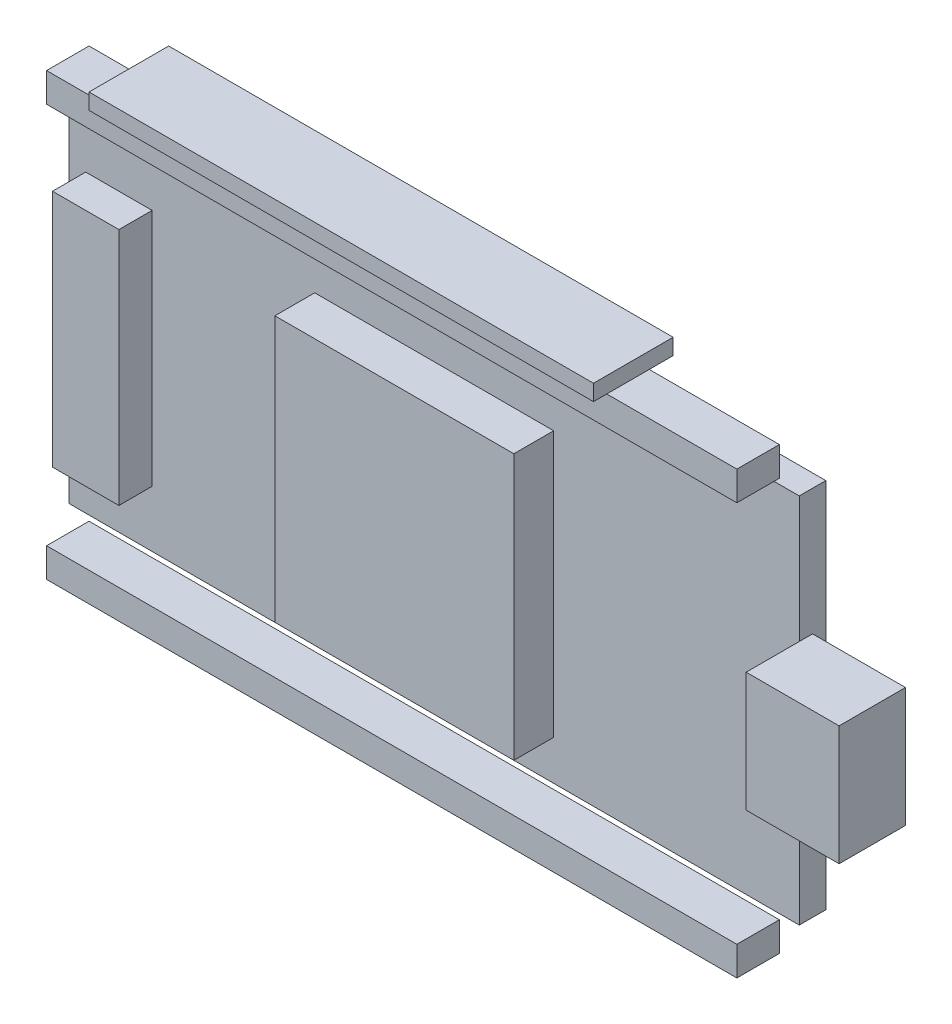
ISO-10303-21;
HEADER;
FILE_DESCRIPTION(('STEP AP214'),'2;1');
FILE_NAME('part.step','',(''),(''),'','','');
FILE_SCHEMA(('AUTOMOTIVE_DESIGN { 1 0 10303 214 1 1 1 1 }'));
ENDSEC;
DATA;
#1=APPLICATION_CONTEXT('core data for automotive mechanical design processes');
#2=APPLICATION_PROTOCOL_DEFINITION('international standard','automotive_design',2000,#1);
#3=PRODUCT_CONTEXT('',#1,'mechanical');
#4=PRODUCT('Part','Part','',(#3));
#5=PRODUCT_RELATED_PRODUCT_CATEGORY('part','',(#4));
#6=PRODUCT_DEFINITION_FORMATION('','',#4);
#7=PRODUCT_DEFINITION_CONTEXT('part definition',#1,'design');
#8=PRODUCT_DEFINITION('design','',#6,#7);
#9=PRODUCT_DEFINITION_SHAPE('','',#8);
#10=(LENGTH_UNIT() NAMED_UNIT(*) SI_UNIT(.MILLI.,.METRE.));
#11=(NAMED_UNIT(*) PLANE_ANGLE_UNIT() SI_UNIT($,.RADIAN.));
#12=(NAMED_UNIT(*) SI_UNIT($,.STERADIAN.) SOLID_ANGLE_UNIT());
#13=UNCERTAINTY_MEASURE_WITH_UNIT(LENGTH_MEASURE(1.E-05),#10,'distance_accuracy_value','');
#14=(GEOMETRIC_REPRESENTATION_CONTEXT(3) GLOBAL_UNCERTAINTY_ASSIGNED_CONTEXT((#13)) GLOBAL_UNIT_ASSIGNED_CONTEXT((#10,
#11,#12)) REPRESENTATION_CONTEXT('',''));
#15=CARTESIAN_POINT('',(0.,0.,0.));
#16=DIRECTION('',(0.,0.,1.));
#17=DIRECTION('',(1.,0.,0.));
#18=AXIS2_PLACEMENT_3D('',#15,#16,#17);
#19=CARTESIAN_POINT('',(19.,19.4,8.));
#20=DIRECTION('',(-1.,0.,0.));
#21=DIRECTION('',(0.,0.,1.));
#22=AXIS2_PLACEMENT_3D('',#19,#20,#21);
#23=PLANE('',#22);
#24=DIRECTION('',(0.,1.,0.));
#25=VECTOR('',#24,1.);
#26=CARTESIAN_POINT('',(19.,19.4,2.));
#27=LINE('',#26,#25);
#28=CARTESIAN_POINT('',(19.,19.4,2.));
#29=VERTEX_POINT('',#28);
#30=CARTESIAN_POINT('',(19.,20.6,2.));
#31=VERTEX_POINT('',#30);
#32=EDGE_CURVE('E109',#29,#31,#27,.T.);
#33=ORIENTED_EDGE('',*,*,#32,.T.);
#34=DIRECTION('',(0.,0.,-1.));
#35=VECTOR('',#34,1.);
#36=CARTESIAN_POINT('',(19.,20.6,8.));
#37=LINE('',#36,#35);
#38=CARTESIAN_POINT('',(19.,20.6,8.));
#39=VERTEX_POINT('',#38);
#40=EDGE_CURVE('E12',#39,#31,#37,.T.);
#41=ORIENTED_EDGE('',*,*,#40,.F.);
#42=DIRECTION('',(0.,1.,0.));
#43=VECTOR('',#42,1.);
#44=CARTESIAN_POINT('',(19.,19.4,8.));
#45=LINE('',#44,#43);
#46=CARTESIAN_POINT('',(19.,19.4,8.));
#47=VERTEX_POINT('',#46);
#48=EDGE_CURVE('E97',#47,#39,#45,.T.);
#49=ORIENTED_EDGE('',*,*,#48,.F.);
#50=DIRECTION('',(0.,0.,-1.));
#51=VECTOR('',#50,1.);
#52=CARTESIAN_POINT('',(19.,19.4,8.));
#53=LINE('',#52,#51);
#54=EDGE_CURVE('E105',#47,#29,#53,.T.);
#55=ORIENTED_EDGE('',*,*,#54,.T.);
#56=EDGE_LOOP('',(#33,#41,#49,#55));
#57=FACE_BOUND('',#56,.T.);
#58=ADVANCED_FACE('F46',(#57),#23,.F.);
#59=CARTESIAN_POINT('',(-19.,20.6,8.));
#60=DIRECTION('',(0.,-1.,0.));
#61=DIRECTION('',(0.,0.,-1.));
#62=AXIS2_PLACEMENT_3D('',#59,#60,#61);
#63=PLANE('',#62);
#64=DIRECTION('',(-1.,0.,0.));
#65=VECTOR('',#64,1.);
#66=CARTESIAN_POINT('',(-19.,20.6,2.));
#67=LINE('',#66,#65);
#68=CARTESIAN_POINT('',(-19.,20.6,2.));
#69=VERTEX_POINT('',#68);
#70=EDGE_CURVE('E101',#31,#69,#67,.T.);
#71=ORIENTED_EDGE('',*,*,#70,.T.);
#72=DIRECTION('',(0.,0.,-1.));
#73=VECTOR('',#72,1.);
#74=CARTESIAN_POINT('',(-19.,20.6,8.));
#75=LINE('',#74,#73);
#76=CARTESIAN_POINT('',(-19.,20.6,8.));
#77=VERTEX_POINT('',#76);
#78=EDGE_CURVE('E54',#77,#69,#75,.T.);
#79=ORIENTED_EDGE('',*,*,#78,.F.);
#80=DIRECTION('',(-1.,0.,0.));
#81=VECTOR('',#80,1.);
#82=CARTESIAN_POINT('',(-19.,20.6,8.));
#83=LINE('',#82,#81);
#84=EDGE_CURVE('E92',#39,#77,#83,.T.);
#85=ORIENTED_EDGE('',*,*,#84,.F.);
#86=ORIENTED_EDGE('',*,*,#40,.T.);
#87=EDGE_LOOP('',(#71,#79,#85,#86));
#88=FACE_BOUND('',#87,.T.);
#89=ADVANCED_FACE('F100',(#88),#63,.F.);
#90=CARTESIAN_POINT('',(-19.,19.4,8.));
#91=DIRECTION('',(1.,0.,0.));
#92=DIRECTION('',(0.,0.,-1.));
#93=AXIS2_PLACEMENT_3D('',#90,#91,#92);
#94=PLANE('',#93);
#95=DIRECTION('',(0.,-1.,0.));
#96=VECTOR('',#95,1.);
#97=CARTESIAN_POINT('',(-19.,19.4,2.));
#98=LINE('',#97,#96);
#99=CARTESIAN_POINT('',(-19.,19.4,2.));
#100=VERTEX_POINT('',#99);
#101=EDGE_CURVE('E79',#69,#100,#98,.T.);
#102=ORIENTED_EDGE('',*,*,#101,.T.);
#103=DIRECTION('',(0.,0.,-1.));
#104=VECTOR('',#103,1.);
#105=CARTESIAN_POINT('',(-19.,19.4,8.));
#106=LINE('',#105,#104);
#107=CARTESIAN_POINT('',(-19.,19.4,8.));
#108=VERTEX_POINT('',#107);
#109=EDGE_CURVE('E102',#108,#100,#106,.T.);
#110=ORIENTED_EDGE('',*,*,#109,.F.);
#111=DIRECTION('',(0.,-1.,0.));
#112=VECTOR('',#111,1.);
#113=CARTESIAN_POINT('',(-19.,19.4,8.));
#114=LINE('',#113,#112);
#115=EDGE_CURVE('E95',#77,#108,#114,.T.);
#116=ORIENTED_EDGE('',*,*,#115,.F.);
#117=ORIENTED_EDGE('',*,*,#78,.T.);
#118=EDGE_LOOP('',(#102,#110,#116,#117));
#119=FACE_BOUND('',#118,.T.);
#120=ADVANCED_FACE('F103',(#119),#94,.F.);
#121=CARTESIAN_POINT('',(-19.,19.4,8.));
#122=DIRECTION('',(0.,1.,0.));
#123=DIRECTION('',(0.,0.,1.));
#124=AXIS2_PLACEMENT_3D('',#121,#122,#123);
#125=PLANE('',#124);
#126=DIRECTION('',(1.,0.,0.));
#127=VECTOR('',#126,1.);
#128=CARTESIAN_POINT('',(-19.,19.4,2.));
#129=LINE('',#128,#127);
#130=EDGE_CURVE('E85',#100,#29,#129,.T.);
#131=ORIENTED_EDGE('',*,*,#130,.T.);
#132=ORIENTED_EDGE('',*,*,#54,.F.);
#133=DIRECTION('',(1.,0.,0.));
#134=VECTOR('',#133,1.);
#135=CARTESIAN_POINT('',(-19.,19.4,8.));
#136=LINE('',#135,#134);
#137=EDGE_CURVE('E62',#108,#47,#136,.T.);
#138=ORIENTED_EDGE('',*,*,#137,.F.);
#139=ORIENTED_EDGE('',*,*,#109,.T.);
#140=EDGE_LOOP('',(#131,#132,#138,#139));
#141=FACE_BOUND('',#140,.T.);
#142=ADVANCED_FACE('F116',(#141),#125,.F.);
#143=CARTESIAN_POINT('',(0.,0.,8.));
#144=DIRECTION('',(0.,0.,-1.));
#145=DIRECTION('',(-1.,0.,0.));
#146=AXIS2_PLACEMENT_3D('',#143,#144,#145);
#147=PLANE('',#146);
#148=ORIENTED_EDGE('',*,*,#48,.T.);
#149=ORIENTED_EDGE('',*,*,#84,.T.);
#150=ORIENTED_EDGE('',*,*,#115,.T.);
#151=ORIENTED_EDGE('',*,*,#137,.T.);
#152=EDGE_LOOP('',(#148,#149,#150,#151));
#153=FACE_BOUND('',#152,.T.);
#154=ADVANCED_FACE('F93',(#153),#147,.F.);
#155=CARTESIAN_POINT('',(0.,0.,2.));
#156=DIRECTION('',(0.,0.,-1.));
#157=DIRECTION('',(-1.,0.,0.));
#158=AXIS2_PLACEMENT_3D('',#155,#156,#157);
#159=PLANE('',#158);
#160=ORIENTED_EDGE('',*,*,#32,.F.);
#161=ORIENTED_EDGE('',*,*,#130,.F.);
#162=ORIENTED_EDGE('',*,*,#101,.F.);
#163=ORIENTED_EDGE('',*,*,#70,.F.);
#164=EDGE_LOOP('',(#160,#161,#162,#163));
#165=FACE_BOUND('',#164,.T.);
#166=ADVANCED_FACE('F119',(#165),#159,.T.);
#167=CLOSED_SHELL('',(#58,#89,#120,#142,#154,#166));
#168=MANIFOLD_SOLID_BREP('B2',#167);
#169=CARTESIAN_POINT('',(26.,14.4,4.2));
#170=DIRECTION('',(-1.,0.,0.));
#171=DIRECTION('',(0.,0.,1.));
#172=AXIS2_PLACEMENT_3D('',#169,#170,#171);
#173=PLANE('',#172);
#174=DIRECTION('',(0.,1.,0.));
#175=VECTOR('',#174,1.);
#176=CARTESIAN_POINT('',(26.,14.4,1.));
#177=LINE('',#176,#175);
#178=CARTESIAN_POINT('',(26.,14.4,1.));
#179=VERTEX_POINT('',#178);
#180=CARTESIAN_POINT('',(26.,16.6,1.));
#181=VERTEX_POINT('',#180);
#182=EDGE_CURVE('E243',#179,#181,#177,.T.);
#183=ORIENTED_EDGE('',*,*,#182,.T.);
#184=DIRECTION('',(0.,0.,-1.));
#185=VECTOR('',#184,1.);
#186=CARTESIAN_POINT('',(26.,16.6,4.2));
#187=LINE('',#186,#185);
#188=CARTESIAN_POINT('',(26.,16.6,4.2));
#189=VERTEX_POINT('',#188);
#190=EDGE_CURVE('E44',#189,#181,#187,.T.);
#191=ORIENTED_EDGE('',*,*,#190,.F.);
#192=DIRECTION('',(0.,1.,0.));
#193=VECTOR('',#192,1.);
#194=CARTESIAN_POINT('',(26.,14.4,4.2));
#195=LINE('',#194,#193);
#196=CARTESIAN_POINT('',(26.,14.4,4.2));
#197=VERTEX_POINT('',#196);
#198=EDGE_CURVE('E231',#197,#189,#195,.T.);
#199=ORIENTED_EDGE('',*,*,#198,.F.);
#200=DIRECTION('',(0.,0.,-1.));
#201=VECTOR('',#200,1.);
#202=CARTESIAN_POINT('',(26.,14.4,4.2));
#203=LINE('',#202,#201);
#204=EDGE_CURVE('E239',#197,#179,#203,.T.);
#205=ORIENTED_EDGE('',*,*,#204,.T.);
#206=EDGE_LOOP('',(#183,#191,#199,#205));
#207=FACE_BOUND('',#206,.T.);
#208=ADVANCED_FACE('F180',(#207),#173,.F.);
#209=CARTESIAN_POINT('',(-26.,16.6,4.2));
#210=DIRECTION('',(0.,-1.,0.));
#211=DIRECTION('',(0.,0.,-1.));
#212=AXIS2_PLACEMENT_3D('',#209,#210,#211);
#213=PLANE('',#212);
#214=DIRECTION('',(-1.,0.,0.));
#215=VECTOR('',#214,1.);
#216=CARTESIAN_POINT('',(-26.,16.6,1.));
#217=LINE('',#216,#215);
#218=CARTESIAN_POINT('',(-26.,16.6,1.));
#219=VERTEX_POINT('',#218);
#220=EDGE_CURVE('E235',#181,#219,#217,.T.);
#221=ORIENTED_EDGE('',*,*,#220,.T.);
#222=DIRECTION('',(0.,0.,-1.));
#223=VECTOR('',#222,1.);
#224=CARTESIAN_POINT('',(-26.,16.6,4.2));
#225=LINE('',#224,#223);
#226=CARTESIAN_POINT('',(-26.,16.6,4.2));
#227=VERTEX_POINT('',#226);
#228=EDGE_CURVE('E188',#227,#219,#225,.T.);
#229=ORIENTED_EDGE('',*,*,#228,.F.);
#230=DIRECTION('',(-1.,0.,0.));
#231=VECTOR('',#230,1.);
#232=CARTESIAN_POINT('',(-26.,16.6,4.2));
#233=LINE('',#232,#231);
#234=EDGE_CURVE('E226',#189,#227,#233,.T.);
#235=ORIENTED_EDGE('',*,*,#234,.F.);
#236=ORIENTED_EDGE('',*,*,#190,.T.);
#237=EDGE_LOOP('',(#221,#229,#235,#236));
#238=FACE_BOUND('',#237,.T.);
#239=ADVANCED_FACE('F234',(#238),#213,.F.);
#240=CARTESIAN_POINT('',(-26.,14.4,4.2));
#241=DIRECTION('',(1.,0.,0.));
#242=DIRECTION('',(0.,0.,-1.));
#243=AXIS2_PLACEMENT_3D('',#240,#241,#242);
#244=PLANE('',#243);
#245=DIRECTION('',(0.,-1.,0.));
#246=VECTOR('',#245,1.);
#247=CARTESIAN_POINT('',(-26.,14.4,1.));
#248=LINE('',#247,#246);
#249=CARTESIAN_POINT('',(-26.,14.4,1.));
#250=VERTEX_POINT('',#249);
#251=EDGE_CURVE('E213',#219,#250,#248,.T.);
#252=ORIENTED_EDGE('',*,*,#251,.T.);
#253=DIRECTION('',(0.,0.,-1.));
#254=VECTOR('',#253,1.);
#255=CARTESIAN_POINT('',(-26.,14.4,4.2));
#256=LINE('',#255,#254);
#257=CARTESIAN_POINT('',(-26.,14.4,4.2));
#258=VERTEX_POINT('',#257);
#259=EDGE_CURVE('E236',#258,#250,#256,.T.);
#260=ORIENTED_EDGE('',*,*,#259,.F.);
#261=DIRECTION('',(0.,-1.,0.));
#262=VECTOR('',#261,1.);
#263=CARTESIAN_POINT('',(-26.,14.4,4.2));
#264=LINE('',#263,#262);
#265=EDGE_CURVE('E229',#227,#258,#264,.T.);
#266=ORIENTED_EDGE('',*,*,#265,.F.);
#267=ORIENTED_EDGE('',*,*,#228,.T.);
#268=EDGE_LOOP('',(#252,#260,#266,#267));
#269=FACE_BOUND('',#268,.T.);
#270=ADVANCED_FACE('F237',(#269),#244,.F.);
#271=CARTESIAN_POINT('',(-26.,14.4,4.2));
#272=DIRECTION('',(0.,1.,0.));
#273=DIRECTION('',(0.,0.,1.));
#274=AXIS2_PLACEMENT_3D('',#271,#272,#273);
#275=PLANE('',#274);
#276=DIRECTION('',(1.,0.,0.));
#277=VECTOR('',#276,1.);
#278=CARTESIAN_POINT('',(-26.,14.4,1.));
#279=LINE('',#278,#277);
#280=EDGE_CURVE('E219',#250,#179,#279,.T.);
#281=ORIENTED_EDGE('',*,*,#280,.T.);
#282=ORIENTED_EDGE('',*,*,#204,.F.);
#283=DIRECTION('',(1.,0.,0.));
#284=VECTOR('',#283,1.);
#285=CARTESIAN_POINT('',(-26.,14.4,4.2));
#286=LINE('',#285,#284);
#287=EDGE_CURVE('E196',#258,#197,#286,.T.);
#288=ORIENTED_EDGE('',*,*,#287,.F.);
#289=ORIENTED_EDGE('',*,*,#259,.T.);
#290=EDGE_LOOP('',(#281,#282,#288,#289));
#291=FACE_BOUND('',#290,.T.);
#292=ADVANCED_FACE('F250',(#291),#275,.F.);
#293=CARTESIAN_POINT('',(0.,0.,4.2));
#294=DIRECTION('',(0.,0.,-1.));
#295=DIRECTION('',(-1.,0.,0.));
#296=AXIS2_PLACEMENT_3D('',#293,#294,#295);
#297=PLANE('',#296);
#298=ORIENTED_EDGE('',*,*,#198,.T.);
#299=ORIENTED_EDGE('',*,*,#234,.T.);
#300=ORIENTED_EDGE('',*,*,#265,.T.);
#301=ORIENTED_EDGE('',*,*,#287,.T.);
#302=EDGE_LOOP('',(#298,#299,#300,#301));
#303=FACE_BOUND('',#302,.T.);
#304=ADVANCED_FACE('F227',(#303),#297,.F.);
#305=CARTESIAN_POINT('',(0.,0.,1.));
#306=DIRECTION('',(0.,0.,-1.));
#307=DIRECTION('',(-1.,0.,0.));
#308=AXIS2_PLACEMENT_3D('',#305,#306,#307);
#309=PLANE('',#308);
#310=ORIENTED_EDGE('',*,*,#182,.F.);
#311=ORIENTED_EDGE('',*,*,#280,.F.);
#312=ORIENTED_EDGE('',*,*,#251,.F.);
#313=ORIENTED_EDGE('',*,*,#220,.F.);
#314=EDGE_LOOP('',(#310,#311,#312,#313));
#315=FACE_BOUND('',#314,.T.);
#316=ADVANCED_FACE('F253',(#315),#309,.T.);
#317=CLOSED_SHELL('',(#208,#239,#270,#292,#304,#316));
#318=MANIFOLD_SOLID_BREP('B6',#317);
#319=CARTESIAN_POINT('',(26.,-16.6,4.2));
#320=DIRECTION('',(-1.,0.,0.));
#321=DIRECTION('',(0.,0.,1.));
#322=AXIS2_PLACEMENT_3D('',#319,#320,#321);
#323=PLANE('',#322);
#324=DIRECTION('',(0.,1.,0.));
#325=VECTOR('',#324,1.);
#326=CARTESIAN_POINT('',(26.,-16.6,1.));
#327=LINE('',#326,#325);
#328=CARTESIAN_POINT('',(26.,-16.6,1.));
#329=VERTEX_POINT('',#328);
#330=CARTESIAN_POINT('',(26.,-14.4,1.));
#331=VERTEX_POINT('',#330);
#332=EDGE_CURVE('E377',#329,#331,#327,.T.);
#333=ORIENTED_EDGE('',*,*,#332,.T.);
#334=DIRECTION('',(0.,0.,-1.));
#335=VECTOR('',#334,1.);
#336=CARTESIAN_POINT('',(26.,-14.4,4.2));
#337=LINE('',#336,#335);
#338=CARTESIAN_POINT('',(26.,-14.4,4.2));
#339=VERTEX_POINT('',#338);
#340=EDGE_CURVE('E178',#339,#331,#337,.T.);
#341=ORIENTED_EDGE('',*,*,#340,.F.);
#342=DIRECTION('',(0.,1.,0.));
#343=VECTOR('',#342,1.);
#344=CARTESIAN_POINT('',(26.,-16.6,4.2));
#345=LINE('',#344,#343);
#346=CARTESIAN_POINT('',(26.,-16.6,4.2));
#347=VERTEX_POINT('',#346);
#348=EDGE_CURVE('E365',#347,#339,#345,.T.);
#349=ORIENTED_EDGE('',*,*,#348,.F.);
#350=DIRECTION('',(0.,0.,-1.));
#351=VECTOR('',#350,1.);
#352=CARTESIAN_POINT('',(26.,-16.6,4.2));
#353=LINE('',#352,#351);
#354=EDGE_CURVE('E373',#347,#329,#353,.T.);
#355=ORIENTED_EDGE('',*,*,#354,.T.);
#356=EDGE_LOOP('',(#333,#341,#349,#355));
#357=FACE_BOUND('',#356,.T.);
#358=ADVANCED_FACE('F314',(#357),#323,.F.);
#359=CARTESIAN_POINT('',(-26.,-14.4,4.2));
#360=DIRECTION('',(0.,-1.,0.));
#361=DIRECTION('',(0.,0.,-1.));
#362=AXIS2_PLACEMENT_3D('',#359,#360,#361);
#363=PLANE('',#362);
#364=DIRECTION('',(-1.,0.,0.));
#365=VECTOR('',#364,1.);
#366=CARTESIAN_POINT('',(-26.,-14.4,1.));
#367=LINE('',#366,#365);
#368=CARTESIAN_POINT('',(-26.,-14.4,1.));
#369=VERTEX_POINT('',#368);
#370=EDGE_CURVE('E369',#331,#369,#367,.T.);
#371=ORIENTED_EDGE('',*,*,#370,.T.);
#372=DIRECTION('',(0.,0.,-1.));
#373=VECTOR('',#372,1.);
#374=CARTESIAN_POINT('',(-26.,-14.4,4.2));
#375=LINE('',#374,#373);
#376=CARTESIAN_POINT('',(-26.,-14.4,4.2));
#377=VERTEX_POINT('',#376);
#378=EDGE_CURVE('E322',#377,#369,#375,.T.);
#379=ORIENTED_EDGE('',*,*,#378,.F.);
#380=DIRECTION('',(-1.,0.,0.));
#381=VECTOR('',#380,1.);
#382=CARTESIAN_POINT('',(-26.,-14.4,4.2));
#383=LINE('',#382,#381);
#384=EDGE_CURVE('E360',#339,#377,#383,.T.);
#385=ORIENTED_EDGE('',*,*,#384,.F.);
#386=ORIENTED_EDGE('',*,*,#340,.T.);
#387=EDGE_LOOP('',(#371,#379,#385,#386));
#388=FACE_BOUND('',#387,.T.);
#389=ADVANCED_FACE('F368',(#388),#363,.F.);
#390=CARTESIAN_POINT('',(-26.,-16.6,4.2));
#391=DIRECTION('',(1.,0.,0.));
#392=DIRECTION('',(0.,0.,-1.));
#393=AXIS2_PLACEMENT_3D('',#390,#391,#392);
#394=PLANE('',#393);
#395=DIRECTION('',(0.,-1.,0.));
#396=VECTOR('',#395,1.);
#397=CARTESIAN_POINT('',(-26.,-16.6,1.));
#398=LINE('',#397,#396);
#399=CARTESIAN_POINT('',(-26.,-16.6,1.));
#400=VERTEX_POINT('',#399);
#401=EDGE_CURVE('E347',#369,#400,#398,.T.);
#402=ORIENTED_EDGE('',*,*,#401,.T.);
#403=DIRECTION('',(0.,0.,-1.));
#404=VECTOR('',#403,1.);
#405=CARTESIAN_POINT('',(-26.,-16.6,4.2));
#406=LINE('',#405,#404);
#407=CARTESIAN_POINT('',(-26.,-16.6,4.2));
#408=VERTEX_POINT('',#407);
#409=EDGE_CURVE('E370',#408,#400,#406,.T.);
#410=ORIENTED_EDGE('',*,*,#409,.F.);
#411=DIRECTION('',(0.,-1.,0.));
#412=VECTOR('',#411,1.);
#413=CARTESIAN_POINT('',(-26.,-16.6,4.2));
#414=LINE('',#413,#412);
#415=EDGE_CURVE('E363',#377,#408,#414,.T.);
#416=ORIENTED_EDGE('',*,*,#415,.F.);
#417=ORIENTED_EDGE('',*,*,#378,.T.);
#418=EDGE_LOOP('',(#402,#410,#416,#417));
#419=FACE_BOUND('',#418,.T.);
#420=ADVANCED_FACE('F371',(#419),#394,.F.);
#421=CARTESIAN_POINT('',(-26.,-16.6,4.2));
#422=DIRECTION('',(0.,1.,0.));
#423=DIRECTION('',(0.,0.,1.));
#424=AXIS2_PLACEMENT_3D('',#421,#422,#423);
#425=PLANE('',#424);
#426=DIRECTION('',(1.,0.,0.));
#427=VECTOR('',#426,1.);
#428=CARTESIAN_POINT('',(-26.,-16.6,1.));
#429=LINE('',#428,#427);
#430=EDGE_CURVE('E353',#400,#329,#429,.T.);
#431=ORIENTED_EDGE('',*,*,#430,.T.);
#432=ORIENTED_EDGE('',*,*,#354,.F.);
#433=DIRECTION('',(1.,0.,0.));
#434=VECTOR('',#433,1.);
#435=CARTESIAN_POINT('',(-26.,-16.6,4.2));
#436=LINE('',#435,#434);
#437=EDGE_CURVE('E330',#408,#347,#436,.T.);
#438=ORIENTED_EDGE('',*,*,#437,.F.);
#439=ORIENTED_EDGE('',*,*,#409,.T.);
#440=EDGE_LOOP('',(#431,#432,#438,#439));
#441=FACE_BOUND('',#440,.T.);
#442=ADVANCED_FACE('F384',(#441),#425,.F.);
#443=CARTESIAN_POINT('',(0.,0.,4.2));
#444=DIRECTION('',(0.,0.,-1.));
#445=DIRECTION('',(-1.,0.,0.));
#446=AXIS2_PLACEMENT_3D('',#443,#444,#445);
#447=PLANE('',#446);
#448=ORIENTED_EDGE('',*,*,#348,.T.);
#449=ORIENTED_EDGE('',*,*,#384,.T.);
#450=ORIENTED_EDGE('',*,*,#415,.T.);
#451=ORIENTED_EDGE('',*,*,#437,.T.);
#452=EDGE_LOOP('',(#448,#449,#450,#451));
#453=FACE_BOUND('',#452,.T.);
#454=ADVANCED_FACE('F361',(#453),#447,.F.);
#455=CARTESIAN_POINT('',(0.,0.,1.));
#456=DIRECTION('',(0.,0.,-1.));
#457=DIRECTION('',(-1.,0.,0.));
#458=AXIS2_PLACEMENT_3D('',#455,#456,#457);
#459=PLANE('',#458);
#460=ORIENTED_EDGE('',*,*,#332,.F.);
#461=ORIENTED_EDGE('',*,*,#430,.F.);
#462=ORIENTED_EDGE('',*,*,#401,.F.);
#463=ORIENTED_EDGE('',*,*,#370,.F.);
#464=EDGE_LOOP('',(#460,#461,#462,#463));
#465=FACE_BOUND('',#464,.T.);
#466=ADVANCED_FACE('F387',(#465),#459,.T.);
#467=CLOSED_SHELL('',(#358,#389,#420,#442,#454,#466));
#468=MANIFOLD_SOLID_BREP('B38',#467);
#469=CARTESIAN_POINT('',(-20.5,-9.,4.25));
#470=DIRECTION('',(-1.,0.,0.));
#471=DIRECTION('',(0.,0.,1.));
#472=AXIS2_PLACEMENT_3D('',#469,#470,#471);
#473=PLANE('',#472);
#474=DIRECTION('',(0.,1.,0.));
#475=VECTOR('',#474,1.);
#476=CARTESIAN_POINT('',(-20.5,-9.,1.75));
#477=LINE('',#476,#475);
#478=CARTESIAN_POINT('',(-20.5,-9.,1.75));
#479=VERTEX_POINT('',#478);
#480=CARTESIAN_POINT('',(-20.5,9.,1.75));
#481=VERTEX_POINT('',#480);
#482=EDGE_CURVE('E511',#479,#481,#477,.T.);
#483=ORIENTED_EDGE('',*,*,#482,.T.);
#484=DIRECTION('',(0.,0.,-1.));
#485=VECTOR('',#484,1.);
#486=CARTESIAN_POINT('',(-20.5,9.,4.25));
#487=LINE('',#486,#485);
#488=CARTESIAN_POINT('',(-20.5,9.,4.25));
#489=VERTEX_POINT('',#488);
#490=EDGE_CURVE('E312',#489,#481,#487,.T.);
#491=ORIENTED_EDGE('',*,*,#490,.F.);
#492=DIRECTION('',(0.,1.,0.));
#493=VECTOR('',#492,1.);
#494=CARTESIAN_POINT('',(-20.5,-9.,4.25));
#495=LINE('',#494,#493);
#496=CARTESIAN_POINT('',(-20.5,-9.,4.25));
#497=VERTEX_POINT('',#496);
#498=EDGE_CURVE('E499',#497,#489,#495,.T.);
#499=ORIENTED_EDGE('',*,*,#498,.F.);
#500=DIRECTION('',(0.,0.,-1.));
#501=VECTOR('',#500,1.);
#502=CARTESIAN_POINT('',(-20.5,-9.,4.25));
#503=LINE('',#502,#501);
#504=EDGE_CURVE('E507',#497,#479,#503,.T.);
#505=ORIENTED_EDGE('',*,*,#504,.T.);
#506=EDGE_LOOP('',(#483,#491,#499,#505));
#507=FACE_BOUND('',#506,.T.);
#508=ADVANCED_FACE('F448',(#507),#473,.F.);
#509=CARTESIAN_POINT('',(-25.5,9.,4.25));
#510=DIRECTION('',(0.,-1.,0.));
#511=DIRECTION('',(0.,0.,-1.));
#512=AXIS2_PLACEMENT_3D('',#509,#510,#511);
#513=PLANE('',#512);
#514=DIRECTION('',(-1.,0.,0.));
#515=VECTOR('',#514,1.);
#516=CARTESIAN_POINT('',(-25.5,9.,1.75));
#517=LINE('',#516,#515);
#518=CARTESIAN_POINT('',(-25.5,9.,1.75));
#519=VERTEX_POINT('',#518);
#520=EDGE_CURVE('E503',#481,#519,#517,.T.);
#521=ORIENTED_EDGE('',*,*,#520,.T.);
#522=DIRECTION('',(0.,0.,-1.));
#523=VECTOR('',#522,1.);
#524=CARTESIAN_POINT('',(-25.5,9.,4.25));
#525=LINE('',#524,#523);
#526=CARTESIAN_POINT('',(-25.5,9.,4.25));
#527=VERTEX_POINT('',#526);
#528=EDGE_CURVE('E456',#527,#519,#525,.T.);
#529=ORIENTED_EDGE('',*,*,#528,.F.);
#530=DIRECTION('',(-1.,0.,0.));
#531=VECTOR('',#530,1.);
#532=CARTESIAN_POINT('',(-25.5,9.,4.25));
#533=LINE('',#532,#531);
#534=EDGE_CURVE('E494',#489,#527,#533,.T.);
#535=ORIENTED_EDGE('',*,*,#534,.F.);
#536=ORIENTED_EDGE('',*,*,#490,.T.);
#537=EDGE_LOOP('',(#521,#529,#535,#536));
#538=FACE_BOUND('',#537,.T.);
#539=ADVANCED_FACE('F502',(#538),#513,.F.);
#540=CARTESIAN_POINT('',(-25.5,-9.,4.25));
#541=DIRECTION('',(1.,0.,0.));
#542=DIRECTION('',(0.,0.,-1.));
#543=AXIS2_PLACEMENT_3D('',#540,#541,#542);
#544=PLANE('',#543);
#545=DIRECTION('',(0.,-1.,0.));
#546=VECTOR('',#545,1.);
#547=CARTESIAN_POINT('',(-25.5,-9.,1.75));
#548=LINE('',#547,#546);
#549=CARTESIAN_POINT('',(-25.5,-9.,1.75));
#550=VERTEX_POINT('',#549);
#551=EDGE_CURVE('E481',#519,#550,#548,.T.);
#552=ORIENTED_EDGE('',*,*,#551,.T.);
#553=DIRECTION('',(0.,0.,-1.));
#554=VECTOR('',#553,1.);
#555=CARTESIAN_POINT('',(-25.5,-9.,4.25));
#556=LINE('',#555,#554);
#557=CARTESIAN_POINT('',(-25.5,-9.,4.25));
#558=VERTEX_POINT('',#557);
#559=EDGE_CURVE('E504',#558,#550,#556,.T.);
#560=ORIENTED_EDGE('',*,*,#559,.F.);
#561=DIRECTION('',(0.,-1.,0.));
#562=VECTOR('',#561,1.);
#563=CARTESIAN_POINT('',(-25.5,-9.,4.25));
#564=LINE('',#563,#562);
#565=EDGE_CURVE('E497',#527,#558,#564,.T.);
#566=ORIENTED_EDGE('',*,*,#565,.F.);
#567=ORIENTED_EDGE('',*,*,#528,.T.);
#568=EDGE_LOOP('',(#552,#560,#566,#567));
#569=FACE_BOUND('',#568,.T.);
#570=ADVANCED_FACE('F505',(#569),#544,.F.);
#571=CARTESIAN_POINT('',(-25.5,-9.,4.25));
#572=DIRECTION('',(0.,1.,0.));
#573=DIRECTION('',(0.,0.,1.));
#574=AXIS2_PLACEMENT_3D('',#571,#572,#573);
#575=PLANE('',#574);
#576=DIRECTION('',(1.,0.,0.));
#577=VECTOR('',#576,1.);
#578=CARTESIAN_POINT('',(-25.5,-9.,1.75));
#579=LINE('',#578,#577);
#580=EDGE_CURVE('E487',#550,#479,#579,.T.);
#581=ORIENTED_EDGE('',*,*,#580,.T.);
#582=ORIENTED_EDGE('',*,*,#504,.F.);
#583=DIRECTION('',(1.,0.,0.));
#584=VECTOR('',#583,1.);
#585=CARTESIAN_POINT('',(-25.5,-9.,4.25));
#586=LINE('',#585,#584);
#587=EDGE_CURVE('E464',#558,#497,#586,.T.);
#588=ORIENTED_EDGE('',*,*,#587,.F.);
#589=ORIENTED_EDGE('',*,*,#559,.T.);
#590=EDGE_LOOP('',(#581,#582,#588,#589));
#591=FACE_BOUND('',#590,.T.);
#592=ADVANCED_FACE('F518',(#591),#575,.F.);
#593=CARTESIAN_POINT('',(0.,0.,4.25));
#594=DIRECTION('',(0.,0.,-1.));
#595=DIRECTION('',(-1.,0.,0.));
#596=AXIS2_PLACEMENT_3D('',#593,#594,#595);
#597=PLANE('',#596);
#598=ORIENTED_EDGE('',*,*,#498,.T.);
#599=ORIENTED_EDGE('',*,*,#534,.T.);
#600=ORIENTED_EDGE('',*,*,#565,.T.);
#601=ORIENTED_EDGE('',*,*,#587,.T.);
#602=EDGE_LOOP('',(#598,#599,#600,#601));
#603=FACE_BOUND('',#602,.T.);
#604=ADVANCED_FACE('F495',(#603),#597,.F.);
#605=CARTESIAN_POINT('',(0.,0.,1.75));
#606=DIRECTION('',(0.,0.,-1.));
#607=DIRECTION('',(-1.,0.,0.));
#608=AXIS2_PLACEMENT_3D('',#605,#606,#607);
#609=PLANE('',#608);
#610=ORIENTED_EDGE('',*,*,#482,.F.);
#611=ORIENTED_EDGE('',*,*,#580,.F.);
#612=ORIENTED_EDGE('',*,*,#551,.F.);
#613=ORIENTED_EDGE('',*,*,#520,.F.);
#614=EDGE_LOOP('',(#610,#611,#612,#613));
#615=FACE_BOUND('',#614,.T.);
#616=ADVANCED_FACE('F521',(#615),#609,.T.);
#617=CLOSED_SHELL('',(#508,#539,#570,#592,#604,#616));
#618=MANIFOLD_SOLID_BREP('B172',#617);
#619=CARTESIAN_POINT('',(34.5,-4.5,5.));
#620=DIRECTION('',(-1.,0.,0.));
#621=DIRECTION('',(0.,0.,1.));
#622=AXIS2_PLACEMENT_3D('',#619,#620,#621);
#623=PLANE('',#622);
#624=DIRECTION('',(0.,1.,0.));
#625=VECTOR('',#624,1.);
#626=CARTESIAN_POINT('',(34.5,-4.5,0.));
#627=LINE('',#626,#625);
#628=CARTESIAN_POINT('',(34.5,-4.5,0.));
#629=VERTEX_POINT('',#628);
#630=CARTESIAN_POINT('',(34.5,4.5,0.));
#631=VERTEX_POINT('',#630);
#632=EDGE_CURVE('E645',#629,#631,#627,.T.);
#633=ORIENTED_EDGE('',*,*,#632,.T.);
#634=DIRECTION('',(0.,0.,-1.));
#635=VECTOR('',#634,1.);
#636=CARTESIAN_POINT('',(34.5,4.5,5.));
#637=LINE('',#636,#635);
#638=CARTESIAN_POINT('',(34.5,4.5,5.));
#639=VERTEX_POINT('',#638);
#640=EDGE_CURVE('E446',#639,#631,#637,.T.);
#641=ORIENTED_EDGE('',*,*,#640,.F.);
#642=DIRECTION('',(0.,1.,0.));
#643=VECTOR('',#642,1.);
#644=CARTESIAN_POINT('',(34.5,-4.5,5.));
#645=LINE('',#644,#643);
#646=CARTESIAN_POINT('',(34.5,-4.5,5.));
#647=VERTEX_POINT('',#646);
#648=EDGE_CURVE('E633',#647,#639,#645,.T.);
#649=ORIENTED_EDGE('',*,*,#648,.F.);
#650=DIRECTION('',(0.,0.,-1.));
#651=VECTOR('',#650,1.);
#652=CARTESIAN_POINT('',(34.5,-4.5,5.));
#653=LINE('',#652,#651);
#654=EDGE_CURVE('E641',#647,#629,#653,.T.);
#655=ORIENTED_EDGE('',*,*,#654,.T.);
#656=EDGE_LOOP('',(#633,#641,#649,#655));
#657=FACE_BOUND('',#656,.T.);
#658=ADVANCED_FACE('F582',(#657),#623,.F.);
#659=CARTESIAN_POINT('',(27.5,4.5,5.));
#660=DIRECTION('',(0.,-1.,0.));
#661=DIRECTION('',(0.,0.,-1.));
#662=AXIS2_PLACEMENT_3D('',#659,#660,#661);
#663=PLANE('',#662);
#664=DIRECTION('',(-1.,0.,0.));
#665=VECTOR('',#664,1.);
#666=CARTESIAN_POINT('',(27.5,4.5,0.));
#667=LINE('',#666,#665);
#668=CARTESIAN_POINT('',(27.5,4.5,0.));
#669=VERTEX_POINT('',#668);
#670=EDGE_CURVE('E637',#631,#669,#667,.T.);
#671=ORIENTED_EDGE('',*,*,#670,.T.);
#672=DIRECTION('',(0.,0.,-1.));
#673=VECTOR('',#672,1.);
#674=CARTESIAN_POINT('',(27.5,4.5,5.));
#675=LINE('',#674,#673);
#676=CARTESIAN_POINT('',(27.5,4.5,5.));
#677=VERTEX_POINT('',#676);
#678=EDGE_CURVE('E590',#677,#669,#675,.T.);
#679=ORIENTED_EDGE('',*,*,#678,.F.);
#680=DIRECTION('',(-1.,0.,0.));
#681=VECTOR('',#680,1.);
#682=CARTESIAN_POINT('',(27.5,4.5,5.));
#683=LINE('',#682,#681);
#684=EDGE_CURVE('E628',#639,#677,#683,.T.);
#685=ORIENTED_EDGE('',*,*,#684,.F.);
#686=ORIENTED_EDGE('',*,*,#640,.T.);
#687=EDGE_LOOP('',(#671,#679,#685,#686));
#688=FACE_BOUND('',#687,.T.);
#689=ADVANCED_FACE('F636',(#688),#663,.F.);
#690=CARTESIAN_POINT('',(27.5,-4.5,5.));
#691=DIRECTION('',(1.,0.,0.));
#692=DIRECTION('',(0.,0.,-1.));
#693=AXIS2_PLACEMENT_3D('',#690,#691,#692);
#694=PLANE('',#693);
#695=DIRECTION('',(0.,-1.,0.));
#696=VECTOR('',#695,1.);
#697=CARTESIAN_POINT('',(27.5,-4.5,0.));
#698=LINE('',#697,#696);
#699=CARTESIAN_POINT('',(27.5,-4.5,0.));
#700=VERTEX_POINT('',#699);
#701=EDGE_CURVE('E615',#669,#700,#698,.T.);
#702=ORIENTED_EDGE('',*,*,#701,.T.);
#703=DIRECTION('',(0.,0.,-1.));
#704=VECTOR('',#703,1.);
#705=CARTESIAN_POINT('',(27.5,-4.5,5.));
#706=LINE('',#705,#704);
#707=CARTESIAN_POINT('',(27.5,-4.5,5.));
#708=VERTEX_POINT('',#707);
#709=EDGE_CURVE('E638',#708,#700,#706,.T.);
#710=ORIENTED_EDGE('',*,*,#709,.F.);
#711=DIRECTION('',(0.,-1.,0.));
#712=VECTOR('',#711,1.);
#713=CARTESIAN_POINT('',(27.5,-4.5,5.));
#714=LINE('',#713,#712);
#715=EDGE_CURVE('E631',#677,#708,#714,.T.);
#716=ORIENTED_EDGE('',*,*,#715,.F.);
#717=ORIENTED_EDGE('',*,*,#678,.T.);
#718=EDGE_LOOP('',(#702,#710,#716,#717));
#719=FACE_BOUND('',#718,.T.);
#720=ADVANCED_FACE('F639',(#719),#694,.F.);
#721=CARTESIAN_POINT('',(27.5,-4.5,5.));
#722=DIRECTION('',(0.,1.,0.));
#723=DIRECTION('',(0.,0.,1.));
#724=AXIS2_PLACEMENT_3D('',#721,#722,#723);
#725=PLANE('',#724);
#726=DIRECTION('',(1.,0.,0.));
#727=VECTOR('',#726,1.);
#728=CARTESIAN_POINT('',(27.5,-4.5,0.));
#729=LINE('',#728,#727);
#730=EDGE_CURVE('E621',#700,#629,#729,.T.);
#731=ORIENTED_EDGE('',*,*,#730,.T.);
#732=ORIENTED_EDGE('',*,*,#654,.F.);
#733=DIRECTION('',(1.,0.,0.));
#734=VECTOR('',#733,1.);
#735=CARTESIAN_POINT('',(27.5,-4.5,5.));
#736=LINE('',#735,#734);
#737=EDGE_CURVE('E598',#708,#647,#736,.T.);
#738=ORIENTED_EDGE('',*,*,#737,.F.);
#739=ORIENTED_EDGE('',*,*,#709,.T.);
#740=EDGE_LOOP('',(#731,#732,#738,#739));
#741=FACE_BOUND('',#740,.T.);
#742=ADVANCED_FACE('F652',(#741),#725,.F.);
#743=CARTESIAN_POINT('',(0.,0.,5.));
#744=DIRECTION('',(0.,0.,-1.));
#745=DIRECTION('',(-1.,0.,0.));
#746=AXIS2_PLACEMENT_3D('',#743,#744,#745);
#747=PLANE('',#746);
#748=ORIENTED_EDGE('',*,*,#648,.T.);
#749=ORIENTED_EDGE('',*,*,#684,.T.);
#750=ORIENTED_EDGE('',*,*,#715,.T.);
#751=ORIENTED_EDGE('',*,*,#737,.T.);
#752=EDGE_LOOP('',(#748,#749,#750,#751));
#753=FACE_BOUND('',#752,.T.);
#754=ADVANCED_FACE('F629',(#753),#747,.F.);
#755=CARTESIAN_POINT('',(0.,0.,0.));
#756=DIRECTION('',(0.,0.,-1.));
#757=DIRECTION('',(-1.,0.,0.));
#758=AXIS2_PLACEMENT_3D('',#755,#756,#757);
#759=PLANE('',#758);
#760=ORIENTED_EDGE('',*,*,#632,.F.);
#761=ORIENTED_EDGE('',*,*,#730,.F.);
#762=ORIENTED_EDGE('',*,*,#701,.F.);
#763=ORIENTED_EDGE('',*,*,#670,.F.);
#764=EDGE_LOOP('',(#760,#761,#762,#763));
#765=FACE_BOUND('',#764,.T.);
#766=ADVANCED_FACE('F655',(#765),#759,.T.);
#767=CLOSED_SHELL('',(#658,#689,#720,#742,#754,#766));
#768=MANIFOLD_SOLID_BREP('B306',#767);
#769=CARTESIAN_POINT('',(10.,-10.,5.));
#770=DIRECTION('',(-1.,0.,0.));
#771=DIRECTION('',(0.,0.,1.));
#772=AXIS2_PLACEMENT_3D('',#769,#770,#771);
#773=PLANE('',#772);
#774=DIRECTION('',(0.,1.,0.));
#775=VECTOR('',#774,1.);
#776=CARTESIAN_POINT('',(10.,-10.,2.));
#777=LINE('',#776,#775);
#778=CARTESIAN_POINT('',(10.,-10.,2.));
#779=VERTEX_POINT('',#778);
#780=CARTESIAN_POINT('',(10.,10.,2.));
#781=VERTEX_POINT('',#780);
#782=EDGE_CURVE('E778',#779,#781,#777,.T.);
#783=ORIENTED_EDGE('',*,*,#782,.T.);
#784=DIRECTION('',(0.,0.,-1.));
#785=VECTOR('',#784,1.);
#786=CARTESIAN_POINT('',(10.,10.,5.));
#787=LINE('',#786,#785);
#788=CARTESIAN_POINT('',(10.,10.,5.));
#789=VERTEX_POINT('',#788);
#790=EDGE_CURVE('E580',#789,#781,#787,.T.);
#791=ORIENTED_EDGE('',*,*,#790,.F.);
#792=DIRECTION('',(0.,1.,0.));
#793=VECTOR('',#792,1.);
#794=CARTESIAN_POINT('',(10.,-10.,5.));
#795=LINE('',#794,#793);
#796=CARTESIAN_POINT('',(10.,-10.,5.));
#797=VERTEX_POINT('',#796);
#798=EDGE_CURVE('E766',#797,#789,#795,.T.);
#799=ORIENTED_EDGE('',*,*,#798,.F.);
#800=DIRECTION('',(0.,0.,-1.));
#801=VECTOR('',#800,1.);
#802=CARTESIAN_POINT('',(10.,-10.,5.));
#803=LINE('',#802,#801);
#804=EDGE_CURVE('E774',#797,#779,#803,.T.);
#805=ORIENTED_EDGE('',*,*,#804,.T.);
#806=EDGE_LOOP('',(#783,#791,#799,#805));
#807=FACE_BOUND('',#806,.T.);
#808=ADVANCED_FACE('F715',(#807),#773,.F.);
#809=CARTESIAN_POINT('',(-8.,10.,5.));
#810=DIRECTION('',(0.,-1.,0.));
#811=DIRECTION('',(0.,0.,-1.));
#812=AXIS2_PLACEMENT_3D('',#809,#810,#811);
#813=PLANE('',#812);
#814=DIRECTION('',(-1.,0.,0.));
#815=VECTOR('',#814,1.);
#816=CARTESIAN_POINT('',(-8.,10.,2.));
#817=LINE('',#816,#815);
#818=CARTESIAN_POINT('',(-8.,10.,2.));
#819=VERTEX_POINT('',#818);
#820=EDGE_CURVE('E770',#781,#819,#817,.T.);
#821=ORIENTED_EDGE('',*,*,#820,.T.);
#822=DIRECTION('',(0.,0.,-1.));
#823=VECTOR('',#822,1.);
#824=CARTESIAN_POINT('',(-8.,10.,5.));
#825=LINE('',#824,#823);
#826=CARTESIAN_POINT('',(-8.,10.,5.));
#827=VERTEX_POINT('',#826);
#828=EDGE_CURVE('E723',#827,#819,#825,.T.);
#829=ORIENTED_EDGE('',*,*,#828,.F.);
#830=DIRECTION('',(-1.,0.,0.));
#831=VECTOR('',#830,1.);
#832=CARTESIAN_POINT('',(-8.,10.,5.));
#833=LINE('',#832,#831);
#834=EDGE_CURVE('E761',#789,#827,#833,.T.);
#835=ORIENTED_EDGE('',*,*,#834,.F.);
#836=ORIENTED_EDGE('',*,*,#790,.T.);
#837=EDGE_LOOP('',(#821,#829,#835,#836));
#838=FACE_BOUND('',#837,.T.);
#839=ADVANCED_FACE('F769',(#838),#813,.F.);
#840=CARTESIAN_POINT('',(-8.,-10.,5.));
#841=DIRECTION('',(1.,0.,0.));
#842=DIRECTION('',(0.,0.,-1.));
#843=AXIS2_PLACEMENT_3D('',#840,#841,#842);
#844=PLANE('',#843);
#845=DIRECTION('',(0.,-1.,0.));
#846=VECTOR('',#845,1.);
#847=CARTESIAN_POINT('',(-8.,-10.,2.));
#848=LINE('',#847,#846);
#849=CARTESIAN_POINT('',(-8.,-10.,2.));
#850=VERTEX_POINT('',#849);
#851=EDGE_CURVE('E748',#819,#850,#848,.T.);
#852=ORIENTED_EDGE('',*,*,#851,.T.);
#853=DIRECTION('',(0.,0.,-1.));
#854=VECTOR('',#853,1.);
#855=CARTESIAN_POINT('',(-8.,-10.,5.));
#856=LINE('',#855,#854);
#857=CARTESIAN_POINT('',(-8.,-10.,5.));
#858=VERTEX_POINT('',#857);
#859=EDGE_CURVE('E771',#858,#850,#856,.T.);
#860=ORIENTED_EDGE('',*,*,#859,.F.);
#861=DIRECTION('',(0.,-1.,0.));
#862=VECTOR('',#861,1.);
#863=CARTESIAN_POINT('',(-8.,-10.,5.));
#864=LINE('',#863,#862);
#865=EDGE_CURVE('E764',#827,#858,#864,.T.);
#866=ORIENTED_EDGE('',*,*,#865,.F.);
#867=ORIENTED_EDGE('',*,*,#828,.T.);
#868=EDGE_LOOP('',(#852,#860,#866,#867));
#869=FACE_BOUND('',#868,.T.);
#870=ADVANCED_FACE('F772',(#869),#844,.F.);
#871=CARTESIAN_POINT('',(-8.,-10.,5.));
#872=DIRECTION('',(0.,1.,0.));
#873=DIRECTION('',(0.,0.,1.));
#874=AXIS2_PLACEMENT_3D('',#871,#872,#873);
#875=PLANE('',#874);
#876=DIRECTION('',(1.,0.,0.));
#877=VECTOR('',#876,1.);
#878=CARTESIAN_POINT('',(-8.,-10.,2.));
#879=LINE('',#878,#877);
#880=EDGE_CURVE('E754',#850,#779,#879,.T.);
#881=ORIENTED_EDGE('',*,*,#880,.T.);
#882=ORIENTED_EDGE('',*,*,#804,.F.);
#883=DIRECTION('',(1.,0.,0.));
#884=VECTOR('',#883,1.);
#885=CARTESIAN_POINT('',(-8.,-10.,5.));
#886=LINE('',#885,#884);
#887=EDGE_CURVE('E731',#858,#797,#886,.T.);
#888=ORIENTED_EDGE('',*,*,#887,.F.);
#889=ORIENTED_EDGE('',*,*,#859,.T.);
#890=EDGE_LOOP('',(#881,#882,#888,#889));
#891=FACE_BOUND('',#890,.T.);
#892=ADVANCED_FACE('F785',(#891),#875,.F.);
#893=CARTESIAN_POINT('',(0.,0.,5.));
#894=DIRECTION('',(0.,0.,-1.));
#895=DIRECTION('',(-1.,0.,0.));
#896=AXIS2_PLACEMENT_3D('',#893,#894,#895);
#897=PLANE('',#896);
#898=ORIENTED_EDGE('',*,*,#798,.T.);
#899=ORIENTED_EDGE('',*,*,#834,.T.);
#900=ORIENTED_EDGE('',*,*,#865,.T.);
#901=ORIENTED_EDGE('',*,*,#887,.T.);
#902=EDGE_LOOP('',(#898,#899,#900,#901));
#903=FACE_BOUND('',#902,.T.);
#904=ADVANCED_FACE('F762',(#903),#897,.F.);
#905=CARTESIAN_POINT('',(0.,0.,2.));
#906=DIRECTION('',(0.,0.,-1.));
#907=DIRECTION('',(-1.,0.,0.));
#908=AXIS2_PLACEMENT_3D('',#905,#906,#907);
#909=PLANE('',#908);
#910=ORIENTED_EDGE('',*,*,#782,.F.);
#911=ORIENTED_EDGE('',*,*,#880,.F.);
#912=ORIENTED_EDGE('',*,*,#851,.F.);
#913=ORIENTED_EDGE('',*,*,#820,.F.);
#914=EDGE_LOOP('',(#910,#911,#912,#913));
#915=FACE_BOUND('',#914,.T.);
#916=ADVANCED_FACE('F788',(#915),#909,.T.);
#917=CLOSED_SHELL('',(#808,#839,#870,#892,#904,#916));
#918=MANIFOLD_SOLID_BREP('B440',#917);
#919=CARTESIAN_POINT('',(27.5,-14.,1.));
#920=DIRECTION('',(-1.,0.,0.));
#921=DIRECTION('',(0.,0.,1.));
#922=AXIS2_PLACEMENT_3D('',#919,#920,#921);
#923=PLANE('',#922);
#924=DIRECTION('',(0.,1.,0.));
#925=VECTOR('',#924,1.);
#926=CARTESIAN_POINT('',(27.5,-14.,-1.));
#927=LINE('',#926,#925);
#928=CARTESIAN_POINT('',(27.5,-14.,-1.));
#929=VERTEX_POINT('',#928);
#930=CARTESIAN_POINT('',(27.5,14.,-1.));
#931=VERTEX_POINT('',#930);
#932=EDGE_CURVE('E902',#929,#931,#927,.T.);
#933=ORIENTED_EDGE('',*,*,#932,.T.);
#934=DIRECTION('',(0.,0.,-1.));
#935=VECTOR('',#934,1.);
#936=CARTESIAN_POINT('',(27.5,14.,1.));
#937=LINE('',#936,#935);
#938=CARTESIAN_POINT('',(27.5,14.,1.));
#939=VERTEX_POINT('',#938);
#940=EDGE_CURVE('E713',#939,#931,#937,.T.);
#941=ORIENTED_EDGE('',*,*,#940,.F.);
#942=DIRECTION('',(0.,1.,0.));
#943=VECTOR('',#942,1.);
#944=CARTESIAN_POINT('',(27.5,-14.,1.));
#945=LINE('',#944,#943);
#946=CARTESIAN_POINT('',(27.5,-14.,1.));
#947=VERTEX_POINT('',#946);
#948=EDGE_CURVE('E890',#947,#939,#945,.T.);
#949=ORIENTED_EDGE('',*,*,#948,.F.);
#950=DIRECTION('',(0.,0.,-1.));
#951=VECTOR('',#950,1.);
#952=CARTESIAN_POINT('',(27.5,-14.,1.));
#953=LINE('',#952,#951);
#954=EDGE_CURVE('E898',#947,#929,#953,.T.);
#955=ORIENTED_EDGE('',*,*,#954,.T.);
#956=EDGE_LOOP('',(#933,#941,#949,#955));
#957=FACE_BOUND('',#956,.T.);
#958=ADVANCED_FACE('F839',(#957),#923,.F.);
#959=CARTESIAN_POINT('',(-27.5,14.,1.));
#960=DIRECTION('',(0.,-1.,0.));
#961=DIRECTION('',(0.,0.,-1.));
#962=AXIS2_PLACEMENT_3D('',#959,#960,#961);
#963=PLANE('',#962);
#964=DIRECTION('',(-1.,0.,0.));
#965=VECTOR('',#964,1.);
#966=CARTESIAN_POINT('',(-27.5,14.,-1.));
#967=LINE('',#966,#965);
#968=CARTESIAN_POINT('',(-27.5,14.,-1.));
#969=VERTEX_POINT('',#968);
#970=EDGE_CURVE('E894',#931,#969,#967,.T.);
#971=ORIENTED_EDGE('',*,*,#970,.T.);
#972=DIRECTION('',(0.,0.,-1.));
#973=VECTOR('',#972,1.);
#974=CARTESIAN_POINT('',(-27.5,14.,1.));
#975=LINE('',#974,#973);
#976=CARTESIAN_POINT('',(-27.5,14.,1.));
#977=VERTEX_POINT('',#976);
#978=EDGE_CURVE('E847',#977,#969,#975,.T.);
#979=ORIENTED_EDGE('',*,*,#978,.F.);
#980=DIRECTION('',(-1.,0.,0.));
#981=VECTOR('',#980,1.);
#982=CARTESIAN_POINT('',(-27.5,14.,1.));
#983=LINE('',#982,#981);
#984=EDGE_CURVE('E885',#939,#977,#983,.T.);
#985=ORIENTED_EDGE('',*,*,#984,.F.);
#986=ORIENTED_EDGE('',*,*,#940,.T.);
#987=EDGE_LOOP('',(#971,#979,#985,#986));
#988=FACE_BOUND('',#987,.T.);
#989=ADVANCED_FACE('F893',(#988),#963,.F.);
#990=CARTESIAN_POINT('',(-27.5,-14.,1.));
#991=DIRECTION('',(1.,0.,0.));
#992=DIRECTION('',(0.,0.,-1.));
#993=AXIS2_PLACEMENT_3D('',#990,#991,#992);
#994=PLANE('',#993);
#995=DIRECTION('',(0.,-1.,0.));
#996=VECTOR('',#995,1.);
#997=CARTESIAN_POINT('',(-27.5,-14.,-1.));
#998=LINE('',#997,#996);
#999=CARTESIAN_POINT('',(-27.5,-14.,-1.));
#1000=VERTEX_POINT('',#999);
#1001=EDGE_CURVE('E872',#969,#1000,#998,.T.);
#1002=ORIENTED_EDGE('',*,*,#1001,.T.);
#1003=DIRECTION('',(0.,0.,-1.));
#1004=VECTOR('',#1003,1.);
#1005=CARTESIAN_POINT('',(-27.5,-14.,1.));
#1006=LINE('',#1005,#1004);
#1007=CARTESIAN_POINT('',(-27.5,-14.,1.));
#1008=VERTEX_POINT('',#1007);
#1009=EDGE_CURVE('E895',#1008,#1000,#1006,.T.);
#1010=ORIENTED_EDGE('',*,*,#1009,.F.);
#1011=DIRECTION('',(0.,-1.,0.));
#1012=VECTOR('',#1011,1.);
#1013=CARTESIAN_POINT('',(-27.5,-14.,1.));
#1014=LINE('',#1013,#1012);
#1015=EDGE_CURVE('E888',#977,#1008,#1014,.T.);
#1016=ORIENTED_EDGE('',*,*,#1015,.F.);
#1017=ORIENTED_EDGE('',*,*,#978,.T.);
#1018=EDGE_LOOP('',(#1002,#1010,#1016,#1017));
#1019=FACE_BOUND('',#1018,.T.);
#1020=ADVANCED_FACE('F896',(#1019),#994,.F.);
#1021=CARTESIAN_POINT('',(-27.5,-14.,1.));
#1022=DIRECTION('',(0.,1.,0.));
#1023=DIRECTION('',(0.,0.,1.));
#1024=AXIS2_PLACEMENT_3D('',#1021,#1022,#1023);
#1025=PLANE('',#1024);
#1026=DIRECTION('',(1.,0.,0.));
#1027=VECTOR('',#1026,1.);
#1028=CARTESIAN_POINT('',(-27.5,-14.,-1.));
#1029=LINE('',#1028,#1027);
#1030=EDGE_CURVE('E878',#1000,#929,#1029,.T.);
#1031=ORIENTED_EDGE('',*,*,#1030,.T.);
#1032=ORIENTED_EDGE('',*,*,#954,.F.);
#1033=DIRECTION('',(1.,0.,0.));
#1034=VECTOR('',#1033,1.);
#1035=CARTESIAN_POINT('',(-27.5,-14.,1.));
#1036=LINE('',#1035,#1034);
#1037=EDGE_CURVE('E855',#1008,#947,#1036,.T.);
#1038=ORIENTED_EDGE('',*,*,#1037,.F.);
#1039=ORIENTED_EDGE('',*,*,#1009,.T.);
#1040=EDGE_LOOP('',(#1031,#1032,#1038,#1039));
#1041=FACE_BOUND('',#1040,.T.);
#1042=ADVANCED_FACE('F909',(#1041),#1025,.F.);
#1043=CARTESIAN_POINT('',(0.,0.,1.));
#1044=DIRECTION('',(0.,0.,-1.));
#1045=DIRECTION('',(-1.,0.,0.));
#1046=AXIS2_PLACEMENT_3D('',#1043,#1044,#1045);
#1047=PLANE('',#1046);
#1048=ORIENTED_EDGE('',*,*,#948,.T.);
#1049=ORIENTED_EDGE('',*,*,#984,.T.);
#1050=ORIENTED_EDGE('',*,*,#1015,.T.);
#1051=ORIENTED_EDGE('',*,*,#1037,.T.);
#1052=EDGE_LOOP('',(#1048,#1049,#1050,#1051));
#1053=FACE_BOUND('',#1052,.T.);
#1054=ADVANCED_FACE('F886',(#1053),#1047,.F.);
#1055=CARTESIAN_POINT('',(0.,0.,-1.));
#1056=DIRECTION('',(0.,0.,-1.));
#1057=DIRECTION('',(-1.,0.,0.));
#1058=AXIS2_PLACEMENT_3D('',#1055,#1056,#1057);
#1059=PLANE('',#1058);
#1060=ORIENTED_EDGE('',*,*,#932,.F.);
#1061=ORIENTED_EDGE('',*,*,#1030,.F.);
#1062=ORIENTED_EDGE('',*,*,#1001,.F.);
#1063=ORIENTED_EDGE('',*,*,#970,.F.);
#1064=EDGE_LOOP('',(#1060,#1061,#1062,#1063));
#1065=FACE_BOUND('',#1064,.T.);
#1066=ADVANCED_FACE('F912',(#1065),#1059,.T.);
#1067=CLOSED_SHELL('',(#958,#989,#1020,#1042,#1054,#1066));
#1068=MANIFOLD_SOLID_BREP('B574',#1067);
#1069=ADVANCED_BREP_SHAPE_REPRESENTATION('',(#18,#168,#318,#468,#618,#768,#918,#1068),#14);
#1070=SHAPE_DEFINITION_REPRESENTATION(#9,#1069);
ENDSEC;
END-ISO-10303-21;
